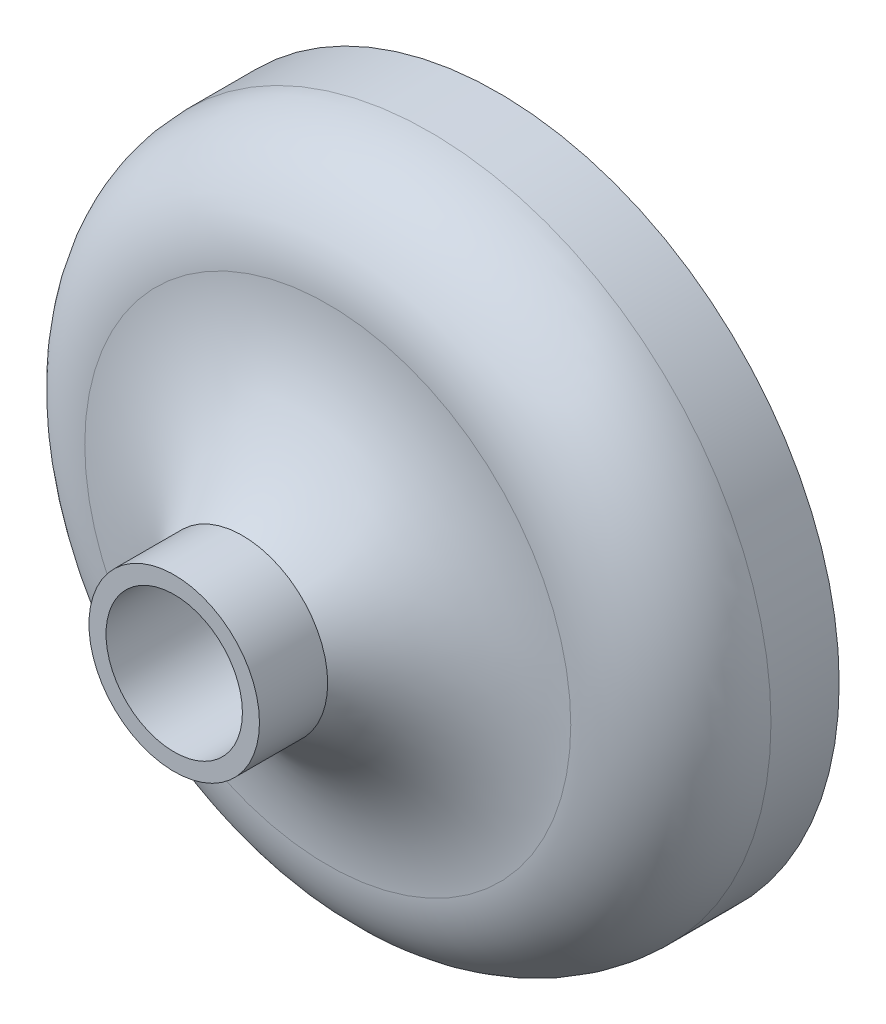
ISO-10303-21;
HEADER;
FILE_DESCRIPTION(('STEP AP214'),'2;1');
FILE_NAME('part.step','',(''),(''),'','','');
FILE_SCHEMA(('AUTOMOTIVE_DESIGN { 1 0 10303 214 1 1 1 1 }'));
ENDSEC;
DATA;
#1=APPLICATION_CONTEXT('core data for automotive mechanical design processes');
#2=APPLICATION_PROTOCOL_DEFINITION('international standard','automotive_design',2000,#1);
#3=PRODUCT_CONTEXT('',#1,'mechanical');
#4=PRODUCT('Part','Part','',(#3));
#5=PRODUCT_RELATED_PRODUCT_CATEGORY('part','',(#4));
#6=PRODUCT_DEFINITION_FORMATION('','',#4);
#7=PRODUCT_DEFINITION_CONTEXT('part definition',#1,'design');
#8=PRODUCT_DEFINITION('design','',#6,#7);
#9=PRODUCT_DEFINITION_SHAPE('','',#8);
#10=(LENGTH_UNIT() NAMED_UNIT(*) SI_UNIT(.MILLI.,.METRE.));
#11=(NAMED_UNIT(*) PLANE_ANGLE_UNIT() SI_UNIT($,.RADIAN.));
#12=(NAMED_UNIT(*) SI_UNIT($,.STERADIAN.) SOLID_ANGLE_UNIT());
#13=UNCERTAINTY_MEASURE_WITH_UNIT(LENGTH_MEASURE(1.E-05),#10,'distance_accuracy_value','');
#14=(GEOMETRIC_REPRESENTATION_CONTEXT(3) GLOBAL_UNCERTAINTY_ASSIGNED_CONTEXT((#13)) GLOBAL_UNIT_ASSIGNED_CONTEXT((#10,
#11,#12)) REPRESENTATION_CONTEXT('',''));
#15=CARTESIAN_POINT('',(0.,0.,0.));
#16=DIRECTION('',(0.,0.,1.));
#17=DIRECTION('',(1.,0.,0.));
#18=AXIS2_PLACEMENT_3D('',#15,#16,#17);
#19=CARTESIAN_POINT('',(0.,0.,0.));
#20=DIRECTION('',(0.,0.,1.));
#21=DIRECTION('',(1.,0.,0.));
#22=AXIS2_PLACEMENT_3D('',#19,#20,#21);
#23=PLANE('',#22);
#24=CARTESIAN_POINT('',(0.,0.,0.));
#25=DIRECTION('',(0.,0.,1.));
#26=DIRECTION('',(1.,0.,0.));
#27=AXIS2_PLACEMENT_3D('',#24,#25,#26);
#28=CIRCLE('',#27,100.);
#29=CARTESIAN_POINT('',(100.,0.,0.));
#30=VERTEX_POINT('',#29);
#31=EDGE_CURVE('E52',#30,#30,#28,.T.);
#32=ORIENTED_EDGE('',*,*,#31,.F.);
#33=EDGE_LOOP('',(#32));
#34=FACE_BOUND('',#33,.T.);
#35=CARTESIAN_POINT('',(0.,0.,0.));
#36=DIRECTION('',(0.,0.,1.));
#37=DIRECTION('',(1.,0.,0.));
#38=AXIS2_PLACEMENT_3D('',#35,#36,#37);
#39=CIRCLE('',#38,95.);
#40=CARTESIAN_POINT('',(95.,0.,0.));
#41=VERTEX_POINT('',#40);
#42=EDGE_CURVE('E57',#41,#41,#39,.T.);
#43=ORIENTED_EDGE('',*,*,#42,.T.);
#44=EDGE_LOOP('',(#43));
#45=FACE_BOUND('',#44,.T.);
#46=ADVANCED_FACE('F37',(#34,#45),#23,.F.);
#47=CARTESIAN_POINT('',(0.,0.,25.));
#48=DIRECTION('',(0.,0.,-1.));
#49=DIRECTION('',(-1.,0.,0.));
#50=AXIS2_PLACEMENT_3D('',#47,#48,#49);
#51=CYLINDRICAL_SURFACE('',#50,100.);
#52=CARTESIAN_POINT('',(0.,0.,20.));
#53=DIRECTION('',(0.,0.,1.));
#54=DIRECTION('',(1.,0.,0.));
#55=AXIS2_PLACEMENT_3D('',#52,#53,#54);
#56=CIRCLE('',#55,100.);
#57=CARTESIAN_POINT('',(100.,0.,20.));
#58=VERTEX_POINT('',#57);
#59=EDGE_CURVE('E48',#58,#58,#56,.F.);
#60=ORIENTED_EDGE('',*,*,#59,.T.);
#61=EDGE_LOOP('',(#60));
#62=FACE_BOUND('',#61,.T.);
#63=ORIENTED_EDGE('',*,*,#31,.T.);
#64=EDGE_LOOP('',(#63));
#65=FACE_BOUND('',#64,.T.);
#66=ADVANCED_FACE('F89',(#62,#65),#51,.T.);
#67=CARTESIAN_POINT('',(0.,0.,25.));
#68=DIRECTION('',(0.,0.,1.));
#69=DIRECTION('',(1.,0.,0.));
#70=AXIS2_PLACEMENT_3D('',#67,#68,#69);
#71=PLANE('',#70);
#72=CARTESIAN_POINT('',(0.,0.,25.));
#73=DIRECTION('',(0.,0.,1.));
#74=DIRECTION('',(1.,0.,0.));
#75=AXIS2_PLACEMENT_3D('',#72,#73,#74);
#76=CIRCLE('',#75,21.6856085069241);
#77=CARTESIAN_POINT('',(21.6856085069241,0.,25.));
#78=VERTEX_POINT('',#77);
#79=EDGE_CURVE('E44',#78,#78,#76,.F.);
#80=ORIENTED_EDGE('',*,*,#79,.T.);
#81=EDGE_LOOP('',(#80));
#82=FACE_BOUND('',#81,.T.);
#83=CARTESIAN_POINT('',(0.,0.,25.));
#84=DIRECTION('',(0.,0.,1.));
#85=DIRECTION('',(1.,0.,0.));
#86=AXIS2_PLACEMENT_3D('',#83,#84,#85);
#87=CIRCLE('',#86,20.);
#88=CARTESIAN_POINT('',(20.,0.,25.));
#89=VERTEX_POINT('',#88);
#90=EDGE_CURVE('E60',#89,#89,#87,.T.);
#91=ORIENTED_EDGE('',*,*,#90,.T.);
#92=EDGE_LOOP('',(#91));
#93=FACE_BOUND('',#92,.T.);
#94=ADVANCED_FACE('F95',(#82,#93),#71,.F.);
#95=CARTESIAN_POINT('',(0.,0.,25.));
#96=DIRECTION('',(0.,0.,1.));
#97=DIRECTION('',(1.,0.,0.));
#98=AXIS2_PLACEMENT_3D('',#95,#96,#97);
#99=CYLINDRICAL_SURFACE('',#98,20.);
#100=ORIENTED_EDGE('',*,*,#90,.F.);
#101=EDGE_LOOP('',(#100));
#102=FACE_BOUND('',#101,.T.);
#103=CARTESIAN_POINT('',(0.,0.,95.));
#104=DIRECTION('',(0.,0.,1.));
#105=DIRECTION('',(1.,0.,0.));
#106=AXIS2_PLACEMENT_3D('',#103,#104,#105);
#107=CIRCLE('',#106,20.);
#108=CARTESIAN_POINT('',(20.,0.,95.));
#109=VERTEX_POINT('',#108);
#110=EDGE_CURVE('E69',#109,#109,#107,.T.);
#111=ORIENTED_EDGE('',*,*,#110,.T.);
#112=EDGE_LOOP('',(#111));
#113=FACE_BOUND('',#112,.T.);
#114=ADVANCED_FACE('F73',(#102,#113),#99,.F.);
#115=CARTESIAN_POINT('',(0.,0.,20.));
#116=DIRECTION('',(0.,0.,1.));
#117=DIRECTION('',(1.,0.,0.));
#118=AXIS2_PLACEMENT_3D('',#115,#116,#117);
#119=TOROIDAL_SURFACE('',#118,70.,30.);
#120=CARTESIAN_POINT('',(0.,0.,49.9733704842422));
#121=DIRECTION('',(0.,0.,-1.));
#122=DIRECTION('',(-1.,0.,0.));
#123=AXIS2_PLACEMENT_3D('',#120,#121,#122);
#124=CIRCLE('',#123,71.2637491103775);
#125=CARTESIAN_POINT('',(-71.2637491103775,0.,49.9733704842422));
#126=VERTEX_POINT('',#125);
#127=EDGE_CURVE('E10',#126,#126,#124,.T.);
#128=ORIENTED_EDGE('',*,*,#127,.T.);
#129=EDGE_LOOP('',(#128));
#130=FACE_BOUND('',#129,.T.);
#131=ORIENTED_EDGE('',*,*,#59,.F.);
#132=EDGE_LOOP('',(#131));
#133=FACE_BOUND('',#132,.T.);
#134=ADVANCED_FACE('F103',(#130,#133),#119,.T.);
#135=CARTESIAN_POINT('',(0.,0.,-95.));
#136=DIRECTION('',(0.,0.,-1.));
#137=DIRECTION('',(-1.,0.,0.));
#138=AXIS2_PLACEMENT_3D('',#135,#136,#137);
#139=DEGENERATE_TOROIDAL_SURFACE('',#138,21.6856085069241,120.,.T.);
#140=ORIENTED_EDGE('',*,*,#79,.F.);
#141=EDGE_LOOP('',(#140));
#142=FACE_BOUND('',#141,.T.);
#143=ORIENTED_EDGE('',*,*,#42,.F.);
#144=EDGE_LOOP('',(#143));
#145=FACE_BOUND('',#144,.T.);
#146=ADVANCED_FACE('F86',(#142,#145),#139,.F.);
#147=CARTESIAN_POINT('',(0.,0.,109.920111452746));
#148=DIRECTION('',(0.,0.,-1.));
#149=DIRECTION('',(-1.,0.,0.));
#150=AXIS2_PLACEMENT_3D('',#147,#148,#149);
#151=TOROIDAL_SURFACE('',#150,73.7912473311334,60.);
#152=ORIENTED_EDGE('',*,*,#127,.F.);
#153=EDGE_LOOP('',(#152));
#154=FACE_BOUND('',#153,.T.);
#155=CARTESIAN_POINT('',(0.,0.,75.));
#156=DIRECTION('',(0.,0.,1.));
#157=DIRECTION('',(1.,0.,0.));
#158=AXIS2_PLACEMENT_3D('',#155,#156,#157);
#159=CIRCLE('',#158,25.);
#160=CARTESIAN_POINT('',(25.,0.,75.));
#161=VERTEX_POINT('',#160);
#162=EDGE_CURVE('E63',#161,#161,#159,.T.);
#163=ORIENTED_EDGE('',*,*,#162,.F.);
#164=EDGE_LOOP('',(#163));
#165=FACE_BOUND('',#164,.T.);
#166=ADVANCED_FACE('F39',(#154,#165),#151,.F.);
#167=CARTESIAN_POINT('',(0.,0.,95.));
#168=DIRECTION('',(0.,0.,1.));
#169=DIRECTION('',(1.,0.,0.));
#170=AXIS2_PLACEMENT_3D('',#167,#168,#169);
#171=PLANE('',#170);
#172=CARTESIAN_POINT('',(0.,0.,95.));
#173=DIRECTION('',(0.,0.,1.));
#174=DIRECTION('',(1.,0.,0.));
#175=AXIS2_PLACEMENT_3D('',#172,#173,#174);
#176=CIRCLE('',#175,25.);
#177=CARTESIAN_POINT('',(25.,0.,95.));
#178=VERTEX_POINT('',#177);
#179=EDGE_CURVE('E66',#178,#178,#176,.T.);
#180=ORIENTED_EDGE('',*,*,#179,.T.);
#181=EDGE_LOOP('',(#180));
#182=FACE_BOUND('',#181,.T.);
#183=ORIENTED_EDGE('',*,*,#110,.F.);
#184=EDGE_LOOP('',(#183));
#185=FACE_BOUND('',#184,.T.);
#186=ADVANCED_FACE('F75',(#182,#185),#171,.T.);
#187=CARTESIAN_POINT('',(0.,0.,95.));
#188=DIRECTION('',(0.,0.,-1.));
#189=DIRECTION('',(-1.,0.,0.));
#190=AXIS2_PLACEMENT_3D('',#187,#188,#189);
#191=CYLINDRICAL_SURFACE('',#190,25.);
#192=ORIENTED_EDGE('',*,*,#179,.F.);
#193=EDGE_LOOP('',(#192));
#194=FACE_BOUND('',#193,.T.);
#195=ORIENTED_EDGE('',*,*,#162,.T.);
#196=EDGE_LOOP('',(#195));
#197=FACE_BOUND('',#196,.T.);
#198=ADVANCED_FACE('F77',(#194,#197),#191,.T.);
#199=CLOSED_SHELL('',(#46,#66,#94,#114,#134,#146,#166,#186,#198));
#200=MANIFOLD_SOLID_BREP('B2',#199);
#201=ADVANCED_BREP_SHAPE_REPRESENTATION('',(#18,#200),#14);
#202=SHAPE_DEFINITION_REPRESENTATION(#9,#201);
ENDSEC;
END-ISO-10303-21;
